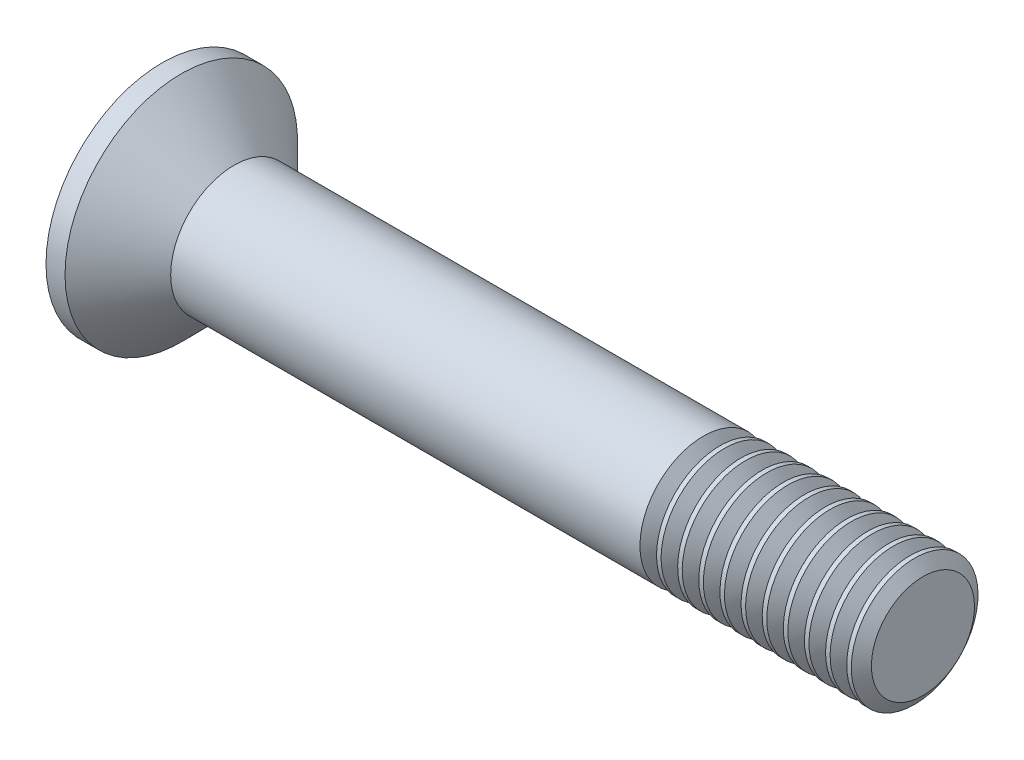
ISO-10303-21;
HEADER;
FILE_DESCRIPTION(('STEP AP214'),'2;1');
FILE_NAME('part.step','',(''),(''),'','','');
FILE_SCHEMA(('AUTOMOTIVE_DESIGN { 1 0 10303 214 1 1 1 1 }'));
ENDSEC;
DATA;
#1=APPLICATION_CONTEXT('core data for automotive mechanical design processes');
#2=APPLICATION_PROTOCOL_DEFINITION('international standard','automotive_design',2000,#1);
#3=PRODUCT_CONTEXT('',#1,'mechanical');
#4=PRODUCT('Part','Part','',(#3));
#5=PRODUCT_RELATED_PRODUCT_CATEGORY('part','',(#4));
#6=PRODUCT_DEFINITION_FORMATION('','',#4);
#7=PRODUCT_DEFINITION_CONTEXT('part definition',#1,'design');
#8=PRODUCT_DEFINITION('design','',#6,#7);
#9=PRODUCT_DEFINITION_SHAPE('','',#8);
#10=(LENGTH_UNIT() NAMED_UNIT(*) SI_UNIT(.MILLI.,.METRE.));
#11=(NAMED_UNIT(*) PLANE_ANGLE_UNIT() SI_UNIT($,.RADIAN.));
#12=(NAMED_UNIT(*) SI_UNIT($,.STERADIAN.) SOLID_ANGLE_UNIT());
#13=UNCERTAINTY_MEASURE_WITH_UNIT(LENGTH_MEASURE(1.E-05),#10,'distance_accuracy_value','');
#14=(GEOMETRIC_REPRESENTATION_CONTEXT(3) GLOBAL_UNCERTAINTY_ASSIGNED_CONTEXT((#13)) GLOBAL_UNIT_ASSIGNED_CONTEXT((#10,
#11,#12)) REPRESENTATION_CONTEXT('',''));
#15=CARTESIAN_POINT('',(0.,0.,0.));
#16=DIRECTION('',(0.,0.,1.));
#17=DIRECTION('',(1.,0.,0.));
#18=AXIS2_PLACEMENT_3D('',#15,#16,#17);
#19=CARTESIAN_POINT('',(0.,0.,0.));
#20=DIRECTION('',(-1.,0.,0.));
#21=DIRECTION('',(0.,0.,1.));
#22=AXIS2_PLACEMENT_3D('',#19,#20,#21);
#23=PLANE('',#22);
#24=CARTESIAN_POINT('',(0.,0.,0.));
#25=DIRECTION('',(-1.,0.,0.));
#26=DIRECTION('',(0.,0.,1.));
#27=AXIS2_PLACEMENT_3D('',#24,#25,#26);
#28=CIRCLE('',#27,2.75);
#29=CARTESIAN_POINT('',(0.,0.,2.75));
#30=VERTEX_POINT('',#29);
#31=EDGE_CURVE('E133',#30,#30,#28,.T.);
#32=ORIENTED_EDGE('',*,*,#31,.T.);
#33=EDGE_LOOP('',(#32));
#34=FACE_BOUND('',#33,.T.);
#35=DIRECTION('',(0.,1.,0.));
#36=VECTOR('',#35,1.);
#37=CARTESIAN_POINT('',(0.,-1.55,-0.395));
#38=LINE('',#37,#36);
#39=CARTESIAN_POINT('',(0.,-1.55,-0.395));
#40=VERTEX_POINT('',#39);
#41=CARTESIAN_POINT('',(0.,-0.394999999999999,-0.395));
#42=VERTEX_POINT('',#41);
#43=EDGE_CURVE('E108',#40,#42,#38,.T.);
#44=ORIENTED_EDGE('',*,*,#43,.T.);
#45=DIRECTION('',(0.,0.,-1.));
#46=VECTOR('',#45,1.);
#47=CARTESIAN_POINT('',(0.,-0.395000000000005,1.55));
#48=LINE('',#47,#46);
#49=CARTESIAN_POINT('',(0.,-0.394999999999995,-1.55));
#50=VERTEX_POINT('',#49);
#51=EDGE_CURVE('E88',#42,#50,#48,.T.);
#52=ORIENTED_EDGE('',*,*,#51,.T.);
#53=DIRECTION('',(0.,1.,0.));
#54=VECTOR('',#53,1.);
#55=CARTESIAN_POINT('',(0.,-0.394999999999995,-1.55));
#56=LINE('',#55,#54);
#57=CARTESIAN_POINT('',(0.,0.395000000000005,-1.55));
#58=VERTEX_POINT('',#57);
#59=EDGE_CURVE('E219',#50,#58,#56,.T.);
#60=ORIENTED_EDGE('',*,*,#59,.T.);
#61=DIRECTION('',(0.,0.,1.));
#62=VECTOR('',#61,1.);
#63=CARTESIAN_POINT('',(0.,0.395000000000005,-1.55));
#64=LINE('',#63,#62);
#65=CARTESIAN_POINT('',(0.,0.395000000000001,-0.395));
#66=VERTEX_POINT('',#65);
#67=EDGE_CURVE('E104',#58,#66,#64,.T.);
#68=ORIENTED_EDGE('',*,*,#67,.T.);
#69=CARTESIAN_POINT('',(0.,1.55,-0.395));
#70=VERTEX_POINT('',#69);
#71=EDGE_CURVE('E98',#66,#70,#38,.T.);
#72=ORIENTED_EDGE('',*,*,#71,.T.);
#73=DIRECTION('',(0.,0.,1.));
#74=VECTOR('',#73,1.);
#75=CARTESIAN_POINT('',(0.,1.55,-0.395));
#76=LINE('',#75,#74);
#77=CARTESIAN_POINT('',(0.,1.55,0.395));
#78=VERTEX_POINT('',#77);
#79=EDGE_CURVE('E101',#70,#78,#76,.T.);
#80=ORIENTED_EDGE('',*,*,#79,.T.);
#81=DIRECTION('',(0.,-1.,0.));
#82=VECTOR('',#81,1.);
#83=CARTESIAN_POINT('',(0.,1.55,0.395));
#84=LINE('',#83,#82);
#85=CARTESIAN_POINT('',(0.,0.394999999999998,0.395));
#86=VERTEX_POINT('',#85);
#87=EDGE_CURVE('E211',#78,#86,#84,.T.);
#88=ORIENTED_EDGE('',*,*,#87,.T.);
#89=CARTESIAN_POINT('',(0.,0.394999999999994,1.55));
#90=VERTEX_POINT('',#89);
#91=EDGE_CURVE('E229',#86,#90,#64,.T.);
#92=ORIENTED_EDGE('',*,*,#91,.T.);
#93=DIRECTION('',(0.,-1.,0.));
#94=VECTOR('',#93,1.);
#95=CARTESIAN_POINT('',(0.,0.394999999999994,1.55));
#96=LINE('',#95,#94);
#97=CARTESIAN_POINT('',(0.,-0.395000000000005,1.55));
#98=VERTEX_POINT('',#97);
#99=EDGE_CURVE('E231',#90,#98,#96,.T.);
#100=ORIENTED_EDGE('',*,*,#99,.T.);
#101=CARTESIAN_POINT('',(0.,-0.395000000000001,0.395));
#102=VERTEX_POINT('',#101);
#103=EDGE_CURVE('E233',#98,#102,#48,.T.);
#104=ORIENTED_EDGE('',*,*,#103,.T.);
#105=CARTESIAN_POINT('',(0.,-1.55,0.395));
#106=VERTEX_POINT('',#105);
#107=EDGE_CURVE('E114',#102,#106,#84,.T.);
#108=ORIENTED_EDGE('',*,*,#107,.T.);
#109=DIRECTION('',(0.,0.,-1.));
#110=VECTOR('',#109,1.);
#111=CARTESIAN_POINT('',(0.,-1.55,0.395));
#112=LINE('',#111,#110);
#113=EDGE_CURVE('E137',#106,#40,#112,.T.);
#114=ORIENTED_EDGE('',*,*,#113,.T.);
#115=EDGE_LOOP('',(#44,#52,#60,#68,#72,#80,#88,#92,#100,#104,#108,#114));
#116=FACE_BOUND('',#115,.T.);
#117=ADVANCED_FACE('F39',(#34,#116),#23,.T.);
#118=CARTESIAN_POINT('',(2.38373382624769,0.,0.16865988909427));
#119=DIRECTION('',(-0.0945267588569114,0.,-0.995522321125954));
#120=DIRECTION('',(-0.995522321125954,0.,0.0945267588569114));
#121=AXIS2_PLACEMENT_3D('',#118,#119,#120);
#122=PLANE('',#121);
#123=ORIENTED_EDGE('',*,*,#107,.F.);
#124=DIRECTION('',(0.991104257398676,0.0941072552097303,-0.09410725520973));
#125=VECTOR('',#124,1.);
#126=CARTESIAN_POINT('',(2.39946475118715,-0.16716620751949,0.167166207519489));
#127=LINE('',#126,#125);
#128=CARTESIAN_POINT('',(2.08,-0.197500000000001,0.197499999999999));
#129=VERTEX_POINT('',#128);
#130=EDGE_CURVE('E132',#102,#129,#127,.T.);
#131=ORIENTED_EDGE('',*,*,#130,.T.);
#132=DIRECTION('',(0.835707904588478,0.543411029305728,-0.0793520726712616));
#133=VECTOR('',#132,1.);
#134=CARTESIAN_POINT('',(0.,-1.55,0.395));
#135=LINE('',#134,#133);
#136=EDGE_CURVE('E109',#106,#129,#135,.T.);
#137=ORIENTED_EDGE('',*,*,#136,.F.);
#138=EDGE_LOOP('',(#123,#131,#137));
#139=FACE_BOUND('',#138,.T.);
#140=ADVANCED_FACE('F170',(#139),#122,.T.);
#141=DIRECTION('',(0.835707904588477,-0.543411029305729,-0.0793520726712615));
#142=VECTOR('',#141,1.);
#143=CARTESIAN_POINT('',(0.,1.55,0.395));
#144=LINE('',#143,#142);
#145=CARTESIAN_POINT('',(2.08,0.1975,0.1975));
#146=VERTEX_POINT('',#145);
#147=EDGE_CURVE('E54',#78,#146,#144,.T.);
#148=ORIENTED_EDGE('',*,*,#147,.T.);
#149=DIRECTION('',(-0.991104257398676,0.0941072552097295,0.0941072552097299));
#150=VECTOR('',#149,1.);
#151=CARTESIAN_POINT('',(2.39946475118715,0.167166207519489,0.167166207519489));
#152=LINE('',#151,#150);
#153=EDGE_CURVE('E215',#146,#86,#152,.T.);
#154=ORIENTED_EDGE('',*,*,#153,.T.);
#155=ORIENTED_EDGE('',*,*,#87,.F.);
#156=EDGE_LOOP('',(#148,#154,#155));
#157=FACE_BOUND('',#156,.T.);
#158=ADVANCED_FACE('F176',(#157),#122,.T.);
#159=CARTESIAN_POINT('',(2.38373382624769,0.,-0.16865988909427));
#160=DIRECTION('',(-0.0945267588569113,0.,0.995522321125954));
#161=DIRECTION('',(0.995522321125954,0.,0.0945267588569113));
#162=AXIS2_PLACEMENT_3D('',#159,#160,#161);
#163=PLANE('',#162);
#164=DIRECTION('',(0.835707904588478,0.543411029305728,0.0793520726712615));
#165=VECTOR('',#164,1.);
#166=CARTESIAN_POINT('',(0.,-1.55,-0.395));
#167=LINE('',#166,#165);
#168=CARTESIAN_POINT('',(2.08,-0.1975,-0.197500000000001));
#169=VERTEX_POINT('',#168);
#170=EDGE_CURVE('E63',#40,#169,#167,.T.);
#171=ORIENTED_EDGE('',*,*,#170,.T.);
#172=DIRECTION('',(-0.991104257398676,-0.0941072552097296,-0.0941072552097298));
#173=VECTOR('',#172,1.);
#174=CARTESIAN_POINT('',(2.39946475118715,-0.167166207519489,-0.167166207519489));
#175=LINE('',#174,#173);
#176=EDGE_CURVE('E11',#169,#42,#175,.T.);
#177=ORIENTED_EDGE('',*,*,#176,.T.);
#178=ORIENTED_EDGE('',*,*,#43,.F.);
#179=EDGE_LOOP('',(#171,#177,#178));
#180=FACE_BOUND('',#179,.T.);
#181=ADVANCED_FACE('F156',(#180),#163,.T.);
#182=ORIENTED_EDGE('',*,*,#71,.F.);
#183=DIRECTION('',(0.991104257398676,-0.0941072552097302,0.0941072552097298));
#184=VECTOR('',#183,1.);
#185=CARTESIAN_POINT('',(2.39946475118715,0.16716620751949,-0.167166207519489));
#186=LINE('',#185,#184);
#187=CARTESIAN_POINT('',(2.08,0.1975,-0.1975));
#188=VERTEX_POINT('',#187);
#189=EDGE_CURVE('E117',#66,#188,#186,.T.);
#190=ORIENTED_EDGE('',*,*,#189,.T.);
#191=DIRECTION('',(0.835707904588477,-0.543411029305729,0.0793520726712615));
#192=VECTOR('',#191,1.);
#193=CARTESIAN_POINT('',(0.,1.55,-0.395));
#194=LINE('',#193,#192);
#195=EDGE_CURVE('E113',#70,#188,#194,.T.);
#196=ORIENTED_EDGE('',*,*,#195,.F.);
#197=EDGE_LOOP('',(#182,#190,#196));
#198=FACE_BOUND('',#197,.T.);
#199=ADVANCED_FACE('F116',(#198),#163,.T.);
#200=CARTESIAN_POINT('',(-6.34999999999999,0.,0.));
#201=DIRECTION('',(-1.,0.,0.));
#202=DIRECTION('',(0.,0.,1.));
#203=AXIS2_PLACEMENT_3D('',#200,#201,#202);
#204=CYLINDRICAL_SURFACE('',#203,1.5);
#205=CARTESIAN_POINT('',(12.8035927855322,0.,0.));
#206=DIRECTION('',(-1.,0.,0.));
#207=DIRECTION('',(0.,-1.,0.));
#208=AXIS2_PLACEMENT_3D('',#205,#206,#207);
#209=CIRCLE('',#208,1.5);
#210=CARTESIAN_POINT('',(12.8035927855322,-1.5,0.));
#211=VERTEX_POINT('',#210);
#212=EDGE_CURVE('E240',#211,#211,#209,.T.);
#213=ORIENTED_EDGE('',*,*,#212,.T.);
#214=EDGE_LOOP('',(#213));
#215=FACE_BOUND('',#214,.T.);
#216=CARTESIAN_POINT('',(1.7,0.,0.));
#217=DIRECTION('',(-1.,0.,0.));
#218=DIRECTION('',(0.,0.,1.));
#219=AXIS2_PLACEMENT_3D('',#216,#217,#218);
#220=CIRCLE('',#219,1.5);
#221=CARTESIAN_POINT('',(1.7,0.,1.5));
#222=VERTEX_POINT('',#221);
#223=EDGE_CURVE('E47',#222,#222,#220,.T.);
#224=ORIENTED_EDGE('',*,*,#223,.F.);
#225=EDGE_LOOP('',(#224));
#226=FACE_BOUND('',#225,.T.);
#227=ADVANCED_FACE('F145',(#215,#226),#204,.T.);
#228=CARTESIAN_POINT('',(0.450000000000004,0.,0.));
#229=DIRECTION('',(-1.,0.,0.));
#230=DIRECTION('',(0.,0.,1.));
#231=AXIS2_PLACEMENT_3D('',#228,#229,#230);
#232=CONICAL_SURFACE('',#231,2.75,0.78539816339745);
#233=ORIENTED_EDGE('',*,*,#223,.T.);
#234=EDGE_LOOP('',(#233));
#235=FACE_BOUND('',#234,.T.);
#236=CARTESIAN_POINT('',(0.450000000000004,0.,0.));
#237=DIRECTION('',(-1.,0.,0.));
#238=DIRECTION('',(0.,0.,1.));
#239=AXIS2_PLACEMENT_3D('',#236,#237,#238);
#240=CIRCLE('',#239,2.75);
#241=CARTESIAN_POINT('',(0.450000000000004,0.,2.75));
#242=VERTEX_POINT('',#241);
#243=EDGE_CURVE('E136',#242,#242,#240,.T.);
#244=ORIENTED_EDGE('',*,*,#243,.F.);
#245=EDGE_LOOP('',(#244));
#246=FACE_BOUND('',#245,.T.);
#247=ADVANCED_FACE('F142',(#235,#246),#232,.T.);
#248=CARTESIAN_POINT('',(-6.34999999999999,0.,0.));
#249=DIRECTION('',(-1.,0.,0.));
#250=DIRECTION('',(0.,0.,1.));
#251=AXIS2_PLACEMENT_3D('',#248,#249,#250);
#252=CYLINDRICAL_SURFACE('',#251,2.75);
#253=ORIENTED_EDGE('',*,*,#243,.T.);
#254=EDGE_LOOP('',(#253));
#255=FACE_BOUND('',#254,.T.);
#256=ORIENTED_EDGE('',*,*,#31,.F.);
#257=EDGE_LOOP('',(#256));
#258=FACE_BOUND('',#257,.T.);
#259=ADVANCED_FACE('F154',(#255,#258),#252,.T.);
#260=CARTESIAN_POINT('',(2.08,0.1975,-0.1975));
#261=DIRECTION('',(1.,0.,0.));
#262=DIRECTION('',(0.,0.,-1.));
#263=AXIS2_PLACEMENT_3D('',#260,#261,#262);
#264=PLANE('',#263);
#265=DIRECTION('',(0.,1.,0.));
#266=VECTOR('',#265,1.);
#267=CARTESIAN_POINT('',(2.08,-0.1975,-0.1975));
#268=LINE('',#267,#266);
#269=EDGE_CURVE('E128',#169,#188,#268,.T.);
#270=ORIENTED_EDGE('',*,*,#269,.F.);
#271=DIRECTION('',(0.,0.,-1.));
#272=VECTOR('',#271,1.);
#273=CARTESIAN_POINT('',(2.08,-0.1975,0.1975));
#274=LINE('',#273,#272);
#275=EDGE_CURVE('E119',#129,#169,#274,.T.);
#276=ORIENTED_EDGE('',*,*,#275,.F.);
#277=DIRECTION('',(0.,-1.,0.));
#278=VECTOR('',#277,1.);
#279=CARTESIAN_POINT('',(2.08,0.1975,0.1975));
#280=LINE('',#279,#278);
#281=EDGE_CURVE('E122',#146,#129,#280,.T.);
#282=ORIENTED_EDGE('',*,*,#281,.F.);
#283=DIRECTION('',(0.,0.,1.));
#284=VECTOR('',#283,1.);
#285=CARTESIAN_POINT('',(2.08,0.1975,-0.1975));
#286=LINE('',#285,#284);
#287=EDGE_CURVE('E126',#188,#146,#286,.T.);
#288=ORIENTED_EDGE('',*,*,#287,.F.);
#289=EDGE_LOOP('',(#270,#276,#282,#288));
#290=FACE_BOUND('',#289,.T.);
#291=ADVANCED_FACE('F181',(#290),#264,.F.);
#292=CARTESIAN_POINT('',(2.08,-0.1975,-0.1975));
#293=DIRECTION('',(-0.54513001368185,0.838351518268576,0.));
#294=DIRECTION('',(-0.838351518268576,-0.54513001368185,0.));
#295=AXIS2_PLACEMENT_3D('',#292,#293,#294);
#296=PLANE('',#295);
#297=ORIENTED_EDGE('',*,*,#170,.F.);
#298=ORIENTED_EDGE('',*,*,#113,.F.);
#299=ORIENTED_EDGE('',*,*,#136,.T.);
#300=ORIENTED_EDGE('',*,*,#275,.T.);
#301=EDGE_LOOP('',(#297,#298,#299,#300));
#302=FACE_BOUND('',#301,.T.);
#303=ADVANCED_FACE('F188',(#302),#296,.T.);
#304=CARTESIAN_POINT('',(0.,1.55,0.395));
#305=DIRECTION('',(-0.54513001368185,-0.838351518268575,0.));
#306=DIRECTION('',(0.838351518268576,-0.54513001368185,0.));
#307=AXIS2_PLACEMENT_3D('',#304,#305,#306);
#308=PLANE('',#307);
#309=ORIENTED_EDGE('',*,*,#147,.F.);
#310=ORIENTED_EDGE('',*,*,#79,.F.);
#311=ORIENTED_EDGE('',*,*,#195,.T.);
#312=ORIENTED_EDGE('',*,*,#287,.T.);
#313=EDGE_LOOP('',(#309,#310,#311,#312));
#314=FACE_BOUND('',#313,.T.);
#315=ADVANCED_FACE('F112',(#314),#308,.T.);
#316=CARTESIAN_POINT('',(2.38373382624769,-0.16865988909427,0.));
#317=DIRECTION('',(-0.0945267588569114,0.995522321125954,0.));
#318=DIRECTION('',(-0.995522321125954,-0.0945267588569114,0.));
#319=AXIS2_PLACEMENT_3D('',#316,#317,#318);
#320=PLANE('',#319);
#321=DIRECTION('',(0.835707904588478,0.0793520726712597,0.543411029305728));
#322=VECTOR('',#321,1.);
#323=CARTESIAN_POINT('',(0.,-0.394999999999995,-1.55));
#324=LINE('',#323,#322);
#325=EDGE_CURVE('E227',#50,#169,#324,.T.);
#326=ORIENTED_EDGE('',*,*,#325,.F.);
#327=ORIENTED_EDGE('',*,*,#51,.F.);
#328=ORIENTED_EDGE('',*,*,#176,.F.);
#329=EDGE_LOOP('',(#326,#327,#328));
#330=FACE_BOUND('',#329,.T.);
#331=ADVANCED_FACE('F433',(#330),#320,.T.);
#332=CARTESIAN_POINT('',(2.38373382624769,0.16865988909427,0.));
#333=DIRECTION('',(-0.0945267588569113,-0.995522321125954,0.));
#334=DIRECTION('',(0.995522321125954,-0.0945267588569113,0.));
#335=AXIS2_PLACEMENT_3D('',#332,#333,#334);
#336=PLANE('',#335);
#337=ORIENTED_EDGE('',*,*,#67,.F.);
#338=DIRECTION('',(0.835707904588478,-0.0793520726712634,0.543411029305728));
#339=VECTOR('',#338,1.);
#340=CARTESIAN_POINT('',(0.,0.395000000000005,-1.55));
#341=LINE('',#340,#339);
#342=EDGE_CURVE('E79',#58,#188,#341,.T.);
#343=ORIENTED_EDGE('',*,*,#342,.T.);
#344=ORIENTED_EDGE('',*,*,#189,.F.);
#345=EDGE_LOOP('',(#337,#343,#344));
#346=FACE_BOUND('',#345,.T.);
#347=ADVANCED_FACE('F432',(#346),#336,.T.);
#348=CARTESIAN_POINT('',(2.08,0.197500000000001,-0.197499999999999));
#349=DIRECTION('',(-0.54513001368185,0.,0.838351518268576));
#350=DIRECTION('',(-0.838351518268576,0.,-0.54513001368185));
#351=AXIS2_PLACEMENT_3D('',#348,#349,#350);
#352=PLANE('',#351);
#353=ORIENTED_EDGE('',*,*,#342,.F.);
#354=ORIENTED_EDGE('',*,*,#59,.F.);
#355=ORIENTED_EDGE('',*,*,#325,.T.);
#356=ORIENTED_EDGE('',*,*,#269,.T.);
#357=EDGE_LOOP('',(#353,#354,#355,#356));
#358=FACE_BOUND('',#357,.T.);
#359=ADVANCED_FACE('F428',(#358),#352,.T.);
#360=ORIENTED_EDGE('',*,*,#103,.F.);
#361=DIRECTION('',(0.835707904588477,0.0793520726712634,-0.543411029305728));
#362=VECTOR('',#361,1.);
#363=CARTESIAN_POINT('',(0.,-0.395000000000005,1.55));
#364=LINE('',#363,#362);
#365=EDGE_CURVE('E222',#98,#129,#364,.T.);
#366=ORIENTED_EDGE('',*,*,#365,.T.);
#367=ORIENTED_EDGE('',*,*,#130,.F.);
#368=EDGE_LOOP('',(#360,#366,#367));
#369=FACE_BOUND('',#368,.T.);
#370=ADVANCED_FACE('F431',(#369),#320,.T.);
#371=DIRECTION('',(0.835707904588477,-0.0793520726712596,-0.543411029305729));
#372=VECTOR('',#371,1.);
#373=CARTESIAN_POINT('',(0.,0.394999999999994,1.55));
#374=LINE('',#373,#372);
#375=EDGE_CURVE('E220',#90,#146,#374,.T.);
#376=ORIENTED_EDGE('',*,*,#375,.F.);
#377=ORIENTED_EDGE('',*,*,#91,.F.);
#378=ORIENTED_EDGE('',*,*,#153,.F.);
#379=EDGE_LOOP('',(#376,#377,#378));
#380=FACE_BOUND('',#379,.T.);
#381=ADVANCED_FACE('F438',(#380),#336,.T.);
#382=CARTESIAN_POINT('',(0.,-0.395000000000005,1.55));
#383=DIRECTION('',(-0.54513001368185,0.,-0.838351518268575));
#384=DIRECTION('',(0.838351518268576,0.,-0.54513001368185));
#385=AXIS2_PLACEMENT_3D('',#382,#383,#384);
#386=PLANE('',#385);
#387=ORIENTED_EDGE('',*,*,#365,.F.);
#388=ORIENTED_EDGE('',*,*,#99,.F.);
#389=ORIENTED_EDGE('',*,*,#375,.T.);
#390=ORIENTED_EDGE('',*,*,#281,.T.);
#391=EDGE_LOOP('',(#387,#388,#389,#390));
#392=FACE_BOUND('',#391,.T.);
#393=ADVANCED_FACE('F426',(#392),#386,.T.);
#394=CARTESIAN_POINT('',(13.1964092144678,0.,0.));
#395=DIRECTION('',(1.,0.,0.));
#396=DIRECTION('',(0.,1.,0.));
#397=AXIS2_PLACEMENT_3D('',#394,#395,#396);
#398=CONICAL_SURFACE('',#397,1.5,0.959931088596888);
#399=CARTESIAN_POINT('',(13.000001,0.,0.));
#400=DIRECTION('',(-1.,0.,0.));
#401=DIRECTION('',(0.,-1.,0.));
#402=AXIS2_PLACEMENT_3D('',#399,#400,#401);
#403=CIRCLE('',#402,1.2195);
#404=CARTESIAN_POINT('',(13.000001,-1.2195,0.));
#405=VERTEX_POINT('',#404);
#406=EDGE_CURVE('E242',#405,#405,#403,.T.);
#407=ORIENTED_EDGE('',*,*,#406,.F.);
#408=EDGE_LOOP('',(#407));
#409=FACE_BOUND('',#408,.T.);
#410=CARTESIAN_POINT('',(13.1964092144678,0.,0.));
#411=DIRECTION('',(-1.,0.,0.));
#412=DIRECTION('',(0.,-1.,0.));
#413=AXIS2_PLACEMENT_3D('',#410,#411,#412);
#414=CIRCLE('',#413,1.5);
#415=CARTESIAN_POINT('',(13.1964092144678,-1.5,0.));
#416=VERTEX_POINT('',#415);
#417=EDGE_CURVE('E223',#416,#416,#414,.T.);
#418=ORIENTED_EDGE('',*,*,#417,.T.);
#419=EDGE_LOOP('',(#418));
#420=FACE_BOUND('',#419,.T.);
#421=ADVANCED_FACE('F422',(#409,#420),#398,.T.);
#422=CARTESIAN_POINT('',(13.000001,0.,0.));
#423=DIRECTION('',(-1.,0.,0.));
#424=DIRECTION('',(0.,-1.,0.));
#425=AXIS2_PLACEMENT_3D('',#422,#423,#424);
#426=CONICAL_SURFACE('',#425,1.2195,0.95993108859688);
#427=ORIENTED_EDGE('',*,*,#212,.F.);
#428=EDGE_LOOP('',(#427));
#429=FACE_BOUND('',#428,.T.);
#430=ORIENTED_EDGE('',*,*,#406,.T.);
#431=EDGE_LOOP('',(#430));
#432=FACE_BOUND('',#431,.T.);
#433=ADVANCED_FACE('F166',(#429,#432),#426,.T.);
#434=CARTESIAN_POINT('',(13.3035927855322,0.,0.));
#435=DIRECTION('',(-1.,0.,0.));
#436=DIRECTION('',(0.,-1.,0.));
#437=AXIS2_PLACEMENT_3D('',#434,#435,#436);
#438=CIRCLE('',#437,1.5);
#439=CARTESIAN_POINT('',(13.3035927855322,-1.5,0.));
#440=VERTEX_POINT('',#439);
#441=EDGE_CURVE('E248',#440,#440,#438,.T.);
#442=ORIENTED_EDGE('',*,*,#441,.T.);
#443=EDGE_LOOP('',(#442));
#444=FACE_BOUND('',#443,.T.);
#445=ORIENTED_EDGE('',*,*,#417,.F.);
#446=EDGE_LOOP('',(#445));
#447=FACE_BOUND('',#446,.T.);
#448=ADVANCED_FACE('F149',(#444,#447),#204,.T.);
#449=CARTESIAN_POINT('',(13.6964092144678,0.,0.));
#450=DIRECTION('',(1.,0.,0.));
#451=DIRECTION('',(0.,1.,0.));
#452=AXIS2_PLACEMENT_3D('',#449,#450,#451);
#453=CONICAL_SURFACE('',#452,1.5,0.959931088596888);
#454=CARTESIAN_POINT('',(13.500001,0.,0.));
#455=DIRECTION('',(-1.,0.,0.));
#456=DIRECTION('',(0.,-1.,0.));
#457=AXIS2_PLACEMENT_3D('',#454,#455,#456);
#458=CIRCLE('',#457,1.2195);
#459=CARTESIAN_POINT('',(13.500001,-1.2195,0.));
#460=VERTEX_POINT('',#459);
#461=EDGE_CURVE('E251',#460,#460,#458,.T.);
#462=ORIENTED_EDGE('',*,*,#461,.F.);
#463=EDGE_LOOP('',(#462));
#464=FACE_BOUND('',#463,.T.);
#465=CARTESIAN_POINT('',(13.6964092144678,0.,0.));
#466=DIRECTION('',(-1.,0.,0.));
#467=DIRECTION('',(0.,-1.,0.));
#468=AXIS2_PLACEMENT_3D('',#465,#466,#467);
#469=CIRCLE('',#468,1.5);
#470=CARTESIAN_POINT('',(13.6964092144678,-1.5,0.));
#471=VERTEX_POINT('',#470);
#472=EDGE_CURVE('E245',#471,#471,#469,.T.);
#473=ORIENTED_EDGE('',*,*,#472,.T.);
#474=EDGE_LOOP('',(#473));
#475=FACE_BOUND('',#474,.T.);
#476=ADVANCED_FACE('F165',(#464,#475),#453,.T.);
#477=CARTESIAN_POINT('',(13.500001,0.,0.));
#478=DIRECTION('',(-1.,0.,0.));
#479=DIRECTION('',(0.,-1.,0.));
#480=AXIS2_PLACEMENT_3D('',#477,#478,#479);
#481=CONICAL_SURFACE('',#480,1.2195,0.95993108859688);
#482=ORIENTED_EDGE('',*,*,#441,.F.);
#483=EDGE_LOOP('',(#482));
#484=FACE_BOUND('',#483,.T.);
#485=ORIENTED_EDGE('',*,*,#461,.T.);
#486=EDGE_LOOP('',(#485));
#487=FACE_BOUND('',#486,.T.);
#488=ADVANCED_FACE('F413',(#484,#487),#481,.T.);
#489=CARTESIAN_POINT('',(13.8035927855322,0.,0.));
#490=DIRECTION('',(-1.,0.,0.));
#491=DIRECTION('',(0.,-1.,0.));
#492=AXIS2_PLACEMENT_3D('',#489,#490,#491);
#493=CIRCLE('',#492,1.5);
#494=CARTESIAN_POINT('',(13.8035927855322,-1.5,0.));
#495=VERTEX_POINT('',#494);
#496=EDGE_CURVE('E257',#495,#495,#493,.T.);
#497=ORIENTED_EDGE('',*,*,#496,.T.);
#498=EDGE_LOOP('',(#497));
#499=FACE_BOUND('',#498,.T.);
#500=ORIENTED_EDGE('',*,*,#472,.F.);
#501=EDGE_LOOP('',(#500));
#502=FACE_BOUND('',#501,.T.);
#503=ADVANCED_FACE('F168',(#499,#502),#204,.T.);
#504=CARTESIAN_POINT('',(14.1964092144678,0.,0.));
#505=DIRECTION('',(1.,0.,0.));
#506=DIRECTION('',(0.,1.,0.));
#507=AXIS2_PLACEMENT_3D('',#504,#505,#506);
#508=CONICAL_SURFACE('',#507,1.5,0.959931088596888);
#509=CARTESIAN_POINT('',(14.000001,0.,0.));
#510=DIRECTION('',(-1.,0.,0.));
#511=DIRECTION('',(0.,-1.,0.));
#512=AXIS2_PLACEMENT_3D('',#509,#510,#511);
#513=CIRCLE('',#512,1.2195);
#514=CARTESIAN_POINT('',(14.000001,-1.2195,0.));
#515=VERTEX_POINT('',#514);
#516=EDGE_CURVE('E260',#515,#515,#513,.T.);
#517=ORIENTED_EDGE('',*,*,#516,.F.);
#518=EDGE_LOOP('',(#517));
#519=FACE_BOUND('',#518,.T.);
#520=CARTESIAN_POINT('',(14.1964092144678,0.,0.));
#521=DIRECTION('',(-1.,0.,0.));
#522=DIRECTION('',(0.,-1.,0.));
#523=AXIS2_PLACEMENT_3D('',#520,#521,#522);
#524=CIRCLE('',#523,1.5);
#525=CARTESIAN_POINT('',(14.1964092144678,-1.5,0.));
#526=VERTEX_POINT('',#525);
#527=EDGE_CURVE('E254',#526,#526,#524,.T.);
#528=ORIENTED_EDGE('',*,*,#527,.T.);
#529=EDGE_LOOP('',(#528));
#530=FACE_BOUND('',#529,.T.);
#531=ADVANCED_FACE('F408',(#519,#530),#508,.T.);
#532=CARTESIAN_POINT('',(14.000001,0.,0.));
#533=DIRECTION('',(-1.,0.,0.));
#534=DIRECTION('',(0.,-1.,0.));
#535=AXIS2_PLACEMENT_3D('',#532,#533,#534);
#536=CONICAL_SURFACE('',#535,1.2195,0.95993108859688);
#537=ORIENTED_EDGE('',*,*,#496,.F.);
#538=EDGE_LOOP('',(#537));
#539=FACE_BOUND('',#538,.T.);
#540=ORIENTED_EDGE('',*,*,#516,.T.);
#541=EDGE_LOOP('',(#540));
#542=FACE_BOUND('',#541,.T.);
#543=ADVANCED_FACE('F405',(#539,#542),#536,.T.);
#544=CARTESIAN_POINT('',(14.3035927855322,0.,0.));
#545=DIRECTION('',(-1.,0.,0.));
#546=DIRECTION('',(0.,-1.,0.));
#547=AXIS2_PLACEMENT_3D('',#544,#545,#546);
#548=CIRCLE('',#547,1.5);
#549=CARTESIAN_POINT('',(14.3035927855322,-1.5,0.));
#550=VERTEX_POINT('',#549);
#551=EDGE_CURVE('E266',#550,#550,#548,.T.);
#552=ORIENTED_EDGE('',*,*,#551,.T.);
#553=EDGE_LOOP('',(#552));
#554=FACE_BOUND('',#553,.T.);
#555=ORIENTED_EDGE('',*,*,#527,.F.);
#556=EDGE_LOOP('',(#555));
#557=FACE_BOUND('',#556,.T.);
#558=ADVANCED_FACE('F403',(#554,#557),#204,.T.);
#559=CARTESIAN_POINT('',(14.6964092144678,0.,0.));
#560=DIRECTION('',(1.,0.,0.));
#561=DIRECTION('',(0.,1.,0.));
#562=AXIS2_PLACEMENT_3D('',#559,#560,#561);
#563=CONICAL_SURFACE('',#562,1.5,0.959931088596888);
#564=CARTESIAN_POINT('',(14.500001,0.,0.));
#565=DIRECTION('',(-1.,0.,0.));
#566=DIRECTION('',(0.,-1.,0.));
#567=AXIS2_PLACEMENT_3D('',#564,#565,#566);
#568=CIRCLE('',#567,1.2195);
#569=CARTESIAN_POINT('',(14.500001,-1.2195,0.));
#570=VERTEX_POINT('',#569);
#571=EDGE_CURVE('E269',#570,#570,#568,.T.);
#572=ORIENTED_EDGE('',*,*,#571,.F.);
#573=EDGE_LOOP('',(#572));
#574=FACE_BOUND('',#573,.T.);
#575=CARTESIAN_POINT('',(14.6964092144678,0.,0.));
#576=DIRECTION('',(-1.,0.,0.));
#577=DIRECTION('',(0.,-1.,0.));
#578=AXIS2_PLACEMENT_3D('',#575,#576,#577);
#579=CIRCLE('',#578,1.5);
#580=CARTESIAN_POINT('',(14.6964092144678,-1.5,0.));
#581=VERTEX_POINT('',#580);
#582=EDGE_CURVE('E263',#581,#581,#579,.T.);
#583=ORIENTED_EDGE('',*,*,#582,.T.);
#584=EDGE_LOOP('',(#583));
#585=FACE_BOUND('',#584,.T.);
#586=ADVANCED_FACE('F399',(#574,#585),#563,.T.);
#587=CARTESIAN_POINT('',(14.500001,0.,0.));
#588=DIRECTION('',(-1.,0.,0.));
#589=DIRECTION('',(0.,-1.,0.));
#590=AXIS2_PLACEMENT_3D('',#587,#588,#589);
#591=CONICAL_SURFACE('',#590,1.2195,0.95993108859688);
#592=ORIENTED_EDGE('',*,*,#551,.F.);
#593=EDGE_LOOP('',(#592));
#594=FACE_BOUND('',#593,.T.);
#595=ORIENTED_EDGE('',*,*,#571,.T.);
#596=EDGE_LOOP('',(#595));
#597=FACE_BOUND('',#596,.T.);
#598=ADVANCED_FACE('F396',(#594,#597),#591,.T.);
#599=CARTESIAN_POINT('',(14.8035927855322,0.,0.));
#600=DIRECTION('',(-1.,0.,0.));
#601=DIRECTION('',(0.,-1.,0.));
#602=AXIS2_PLACEMENT_3D('',#599,#600,#601);
#603=CIRCLE('',#602,1.5);
#604=CARTESIAN_POINT('',(14.8035927855322,-1.5,0.));
#605=VERTEX_POINT('',#604);
#606=EDGE_CURVE('E275',#605,#605,#603,.T.);
#607=ORIENTED_EDGE('',*,*,#606,.T.);
#608=EDGE_LOOP('',(#607));
#609=FACE_BOUND('',#608,.T.);
#610=ORIENTED_EDGE('',*,*,#582,.F.);
#611=EDGE_LOOP('',(#610));
#612=FACE_BOUND('',#611,.T.);
#613=ADVANCED_FACE('F394',(#609,#612),#204,.T.);
#614=CARTESIAN_POINT('',(15.1964092144678,0.,0.));
#615=DIRECTION('',(1.,0.,0.));
#616=DIRECTION('',(0.,1.,0.));
#617=AXIS2_PLACEMENT_3D('',#614,#615,#616);
#618=CONICAL_SURFACE('',#617,1.5,0.959931088596888);
#619=CARTESIAN_POINT('',(15.000001,0.,0.));
#620=DIRECTION('',(-1.,0.,0.));
#621=DIRECTION('',(0.,-1.,0.));
#622=AXIS2_PLACEMENT_3D('',#619,#620,#621);
#623=CIRCLE('',#622,1.2195);
#624=CARTESIAN_POINT('',(15.000001,-1.2195,0.));
#625=VERTEX_POINT('',#624);
#626=EDGE_CURVE('E278',#625,#625,#623,.T.);
#627=ORIENTED_EDGE('',*,*,#626,.F.);
#628=EDGE_LOOP('',(#627));
#629=FACE_BOUND('',#628,.T.);
#630=CARTESIAN_POINT('',(15.1964092144678,0.,0.));
#631=DIRECTION('',(-1.,0.,0.));
#632=DIRECTION('',(0.,-1.,0.));
#633=AXIS2_PLACEMENT_3D('',#630,#631,#632);
#634=CIRCLE('',#633,1.5);
#635=CARTESIAN_POINT('',(15.1964092144678,-1.5,0.));
#636=VERTEX_POINT('',#635);
#637=EDGE_CURVE('E272',#636,#636,#634,.T.);
#638=ORIENTED_EDGE('',*,*,#637,.T.);
#639=EDGE_LOOP('',(#638));
#640=FACE_BOUND('',#639,.T.);
#641=ADVANCED_FACE('F390',(#629,#640),#618,.T.);
#642=CARTESIAN_POINT('',(15.000001,0.,0.));
#643=DIRECTION('',(-1.,0.,0.));
#644=DIRECTION('',(0.,-1.,0.));
#645=AXIS2_PLACEMENT_3D('',#642,#643,#644);
#646=CONICAL_SURFACE('',#645,1.2195,0.95993108859688);
#647=ORIENTED_EDGE('',*,*,#606,.F.);
#648=EDGE_LOOP('',(#647));
#649=FACE_BOUND('',#648,.T.);
#650=ORIENTED_EDGE('',*,*,#626,.T.);
#651=EDGE_LOOP('',(#650));
#652=FACE_BOUND('',#651,.T.);
#653=ADVANCED_FACE('F387',(#649,#652),#646,.T.);
#654=CARTESIAN_POINT('',(15.3035927855322,0.,0.));
#655=DIRECTION('',(-1.,0.,0.));
#656=DIRECTION('',(0.,-1.,0.));
#657=AXIS2_PLACEMENT_3D('',#654,#655,#656);
#658=CIRCLE('',#657,1.5);
#659=CARTESIAN_POINT('',(15.3035927855322,-1.5,0.));
#660=VERTEX_POINT('',#659);
#661=EDGE_CURVE('E284',#660,#660,#658,.T.);
#662=ORIENTED_EDGE('',*,*,#661,.T.);
#663=EDGE_LOOP('',(#662));
#664=FACE_BOUND('',#663,.T.);
#665=ORIENTED_EDGE('',*,*,#637,.F.);
#666=EDGE_LOOP('',(#665));
#667=FACE_BOUND('',#666,.T.);
#668=ADVANCED_FACE('F385',(#664,#667),#204,.T.);
#669=CARTESIAN_POINT('',(15.6964092144678,0.,0.));
#670=DIRECTION('',(1.,0.,0.));
#671=DIRECTION('',(0.,1.,0.));
#672=AXIS2_PLACEMENT_3D('',#669,#670,#671);
#673=CONICAL_SURFACE('',#672,1.5,0.959931088596888);
#674=CARTESIAN_POINT('',(15.500001,0.,0.));
#675=DIRECTION('',(-1.,0.,0.));
#676=DIRECTION('',(0.,-1.,0.));
#677=AXIS2_PLACEMENT_3D('',#674,#675,#676);
#678=CIRCLE('',#677,1.2195);
#679=CARTESIAN_POINT('',(15.500001,-1.2195,0.));
#680=VERTEX_POINT('',#679);
#681=EDGE_CURVE('E287',#680,#680,#678,.T.);
#682=ORIENTED_EDGE('',*,*,#681,.F.);
#683=EDGE_LOOP('',(#682));
#684=FACE_BOUND('',#683,.T.);
#685=CARTESIAN_POINT('',(15.6964092144678,0.,0.));
#686=DIRECTION('',(-1.,0.,0.));
#687=DIRECTION('',(0.,-1.,0.));
#688=AXIS2_PLACEMENT_3D('',#685,#686,#687);
#689=CIRCLE('',#688,1.5);
#690=CARTESIAN_POINT('',(15.6964092144678,-1.5,0.));
#691=VERTEX_POINT('',#690);
#692=EDGE_CURVE('E281',#691,#691,#689,.T.);
#693=ORIENTED_EDGE('',*,*,#692,.T.);
#694=EDGE_LOOP('',(#693));
#695=FACE_BOUND('',#694,.T.);
#696=ADVANCED_FACE('F381',(#684,#695),#673,.T.);
#697=CARTESIAN_POINT('',(15.500001,0.,0.));
#698=DIRECTION('',(-1.,0.,0.));
#699=DIRECTION('',(0.,-1.,0.));
#700=AXIS2_PLACEMENT_3D('',#697,#698,#699);
#701=CONICAL_SURFACE('',#700,1.2195,0.95993108859688);
#702=ORIENTED_EDGE('',*,*,#661,.F.);
#703=EDGE_LOOP('',(#702));
#704=FACE_BOUND('',#703,.T.);
#705=ORIENTED_EDGE('',*,*,#681,.T.);
#706=EDGE_LOOP('',(#705));
#707=FACE_BOUND('',#706,.T.);
#708=ADVANCED_FACE('F378',(#704,#707),#701,.T.);
#709=CARTESIAN_POINT('',(15.8035927855322,0.,0.));
#710=DIRECTION('',(-1.,0.,0.));
#711=DIRECTION('',(0.,-1.,0.));
#712=AXIS2_PLACEMENT_3D('',#709,#710,#711);
#713=CIRCLE('',#712,1.5);
#714=CARTESIAN_POINT('',(15.8035927855322,-1.5,0.));
#715=VERTEX_POINT('',#714);
#716=EDGE_CURVE('E293',#715,#715,#713,.T.);
#717=ORIENTED_EDGE('',*,*,#716,.T.);
#718=EDGE_LOOP('',(#717));
#719=FACE_BOUND('',#718,.T.);
#720=ORIENTED_EDGE('',*,*,#692,.F.);
#721=EDGE_LOOP('',(#720));
#722=FACE_BOUND('',#721,.T.);
#723=ADVANCED_FACE('F376',(#719,#722),#204,.T.);
#724=CARTESIAN_POINT('',(16.1964092144678,0.,0.));
#725=DIRECTION('',(1.,0.,0.));
#726=DIRECTION('',(0.,1.,0.));
#727=AXIS2_PLACEMENT_3D('',#724,#725,#726);
#728=CONICAL_SURFACE('',#727,1.5,0.959931088596888);
#729=CARTESIAN_POINT('',(16.000001,0.,0.));
#730=DIRECTION('',(-1.,0.,0.));
#731=DIRECTION('',(0.,-1.,0.));
#732=AXIS2_PLACEMENT_3D('',#729,#730,#731);
#733=CIRCLE('',#732,1.2195);
#734=CARTESIAN_POINT('',(16.000001,-1.2195,0.));
#735=VERTEX_POINT('',#734);
#736=EDGE_CURVE('E296',#735,#735,#733,.T.);
#737=ORIENTED_EDGE('',*,*,#736,.F.);
#738=EDGE_LOOP('',(#737));
#739=FACE_BOUND('',#738,.T.);
#740=CARTESIAN_POINT('',(16.1964092144678,0.,0.));
#741=DIRECTION('',(-1.,0.,0.));
#742=DIRECTION('',(0.,-1.,0.));
#743=AXIS2_PLACEMENT_3D('',#740,#741,#742);
#744=CIRCLE('',#743,1.5);
#745=CARTESIAN_POINT('',(16.1964092144678,-1.5,0.));
#746=VERTEX_POINT('',#745);
#747=EDGE_CURVE('E290',#746,#746,#744,.T.);
#748=ORIENTED_EDGE('',*,*,#747,.T.);
#749=EDGE_LOOP('',(#748));
#750=FACE_BOUND('',#749,.T.);
#751=ADVANCED_FACE('F372',(#739,#750),#728,.T.);
#752=CARTESIAN_POINT('',(16.000001,0.,0.));
#753=DIRECTION('',(-1.,0.,0.));
#754=DIRECTION('',(0.,-1.,0.));
#755=AXIS2_PLACEMENT_3D('',#752,#753,#754);
#756=CONICAL_SURFACE('',#755,1.2195,0.95993108859688);
#757=ORIENTED_EDGE('',*,*,#716,.F.);
#758=EDGE_LOOP('',(#757));
#759=FACE_BOUND('',#758,.T.);
#760=ORIENTED_EDGE('',*,*,#736,.T.);
#761=EDGE_LOOP('',(#760));
#762=FACE_BOUND('',#761,.T.);
#763=ADVANCED_FACE('F369',(#759,#762),#756,.T.);
#764=CARTESIAN_POINT('',(16.3035927855322,0.,0.));
#765=DIRECTION('',(-1.,0.,0.));
#766=DIRECTION('',(0.,-1.,0.));
#767=AXIS2_PLACEMENT_3D('',#764,#765,#766);
#768=CIRCLE('',#767,1.5);
#769=CARTESIAN_POINT('',(16.3035927855322,-1.5,0.));
#770=VERTEX_POINT('',#769);
#771=EDGE_CURVE('E302',#770,#770,#768,.T.);
#772=ORIENTED_EDGE('',*,*,#771,.T.);
#773=EDGE_LOOP('',(#772));
#774=FACE_BOUND('',#773,.T.);
#775=ORIENTED_EDGE('',*,*,#747,.F.);
#776=EDGE_LOOP('',(#775));
#777=FACE_BOUND('',#776,.T.);
#778=ADVANCED_FACE('F367',(#774,#777),#204,.T.);
#779=CARTESIAN_POINT('',(16.6964092144678,0.,0.));
#780=DIRECTION('',(1.,0.,0.));
#781=DIRECTION('',(0.,1.,0.));
#782=AXIS2_PLACEMENT_3D('',#779,#780,#781);
#783=CONICAL_SURFACE('',#782,1.5,0.959931088596888);
#784=CARTESIAN_POINT('',(16.500001,0.,0.));
#785=DIRECTION('',(-1.,0.,0.));
#786=DIRECTION('',(0.,-1.,0.));
#787=AXIS2_PLACEMENT_3D('',#784,#785,#786);
#788=CIRCLE('',#787,1.2195);
#789=CARTESIAN_POINT('',(16.500001,-1.2195,0.));
#790=VERTEX_POINT('',#789);
#791=EDGE_CURVE('E305',#790,#790,#788,.T.);
#792=ORIENTED_EDGE('',*,*,#791,.F.);
#793=EDGE_LOOP('',(#792));
#794=FACE_BOUND('',#793,.T.);
#795=CARTESIAN_POINT('',(16.6964092144678,0.,0.));
#796=DIRECTION('',(-1.,0.,0.));
#797=DIRECTION('',(0.,-1.,0.));
#798=AXIS2_PLACEMENT_3D('',#795,#796,#797);
#799=CIRCLE('',#798,1.5);
#800=CARTESIAN_POINT('',(16.6964092144678,-1.5,0.));
#801=VERTEX_POINT('',#800);
#802=EDGE_CURVE('E299',#801,#801,#799,.T.);
#803=ORIENTED_EDGE('',*,*,#802,.T.);
#804=EDGE_LOOP('',(#803));
#805=FACE_BOUND('',#804,.T.);
#806=ADVANCED_FACE('F363',(#794,#805),#783,.T.);
#807=CARTESIAN_POINT('',(16.500001,0.,0.));
#808=DIRECTION('',(-1.,0.,0.));
#809=DIRECTION('',(0.,-1.,0.));
#810=AXIS2_PLACEMENT_3D('',#807,#808,#809);
#811=CONICAL_SURFACE('',#810,1.2195,0.95993108859688);
#812=ORIENTED_EDGE('',*,*,#771,.F.);
#813=EDGE_LOOP('',(#812));
#814=FACE_BOUND('',#813,.T.);
#815=ORIENTED_EDGE('',*,*,#791,.T.);
#816=EDGE_LOOP('',(#815));
#817=FACE_BOUND('',#816,.T.);
#818=ADVANCED_FACE('F360',(#814,#817),#811,.T.);
#819=CARTESIAN_POINT('',(16.8035927855322,0.,0.));
#820=DIRECTION('',(-1.,0.,0.));
#821=DIRECTION('',(0.,-1.,0.));
#822=AXIS2_PLACEMENT_3D('',#819,#820,#821);
#823=CIRCLE('',#822,1.5);
#824=CARTESIAN_POINT('',(16.8035927855322,-1.5,0.));
#825=VERTEX_POINT('',#824);
#826=EDGE_CURVE('E311',#825,#825,#823,.T.);
#827=ORIENTED_EDGE('',*,*,#826,.T.);
#828=EDGE_LOOP('',(#827));
#829=FACE_BOUND('',#828,.T.);
#830=ORIENTED_EDGE('',*,*,#802,.F.);
#831=EDGE_LOOP('',(#830));
#832=FACE_BOUND('',#831,.T.);
#833=ADVANCED_FACE('F358',(#829,#832),#204,.T.);
#834=CARTESIAN_POINT('',(17.1964092144678,0.,0.));
#835=DIRECTION('',(1.,0.,0.));
#836=DIRECTION('',(0.,1.,0.));
#837=AXIS2_PLACEMENT_3D('',#834,#835,#836);
#838=CONICAL_SURFACE('',#837,1.5,0.959931088596888);
#839=CARTESIAN_POINT('',(17.000001,0.,0.));
#840=DIRECTION('',(-1.,0.,0.));
#841=DIRECTION('',(0.,-1.,0.));
#842=AXIS2_PLACEMENT_3D('',#839,#840,#841);
#843=CIRCLE('',#842,1.2195);
#844=CARTESIAN_POINT('',(17.000001,-1.2195,0.));
#845=VERTEX_POINT('',#844);
#846=EDGE_CURVE('E314',#845,#845,#843,.T.);
#847=ORIENTED_EDGE('',*,*,#846,.F.);
#848=EDGE_LOOP('',(#847));
#849=FACE_BOUND('',#848,.T.);
#850=CARTESIAN_POINT('',(17.1964092144678,0.,0.));
#851=DIRECTION('',(-1.,0.,0.));
#852=DIRECTION('',(0.,-1.,0.));
#853=AXIS2_PLACEMENT_3D('',#850,#851,#852);
#854=CIRCLE('',#853,1.5);
#855=CARTESIAN_POINT('',(17.1964092144678,-1.5,0.));
#856=VERTEX_POINT('',#855);
#857=EDGE_CURVE('E308',#856,#856,#854,.T.);
#858=ORIENTED_EDGE('',*,*,#857,.T.);
#859=EDGE_LOOP('',(#858));
#860=FACE_BOUND('',#859,.T.);
#861=ADVANCED_FACE('F354',(#849,#860),#838,.T.);
#862=CARTESIAN_POINT('',(17.000001,0.,0.));
#863=DIRECTION('',(-1.,0.,0.));
#864=DIRECTION('',(0.,-1.,0.));
#865=AXIS2_PLACEMENT_3D('',#862,#863,#864);
#866=CONICAL_SURFACE('',#865,1.2195,0.95993108859688);
#867=ORIENTED_EDGE('',*,*,#826,.F.);
#868=EDGE_LOOP('',(#867));
#869=FACE_BOUND('',#868,.T.);
#870=ORIENTED_EDGE('',*,*,#846,.T.);
#871=EDGE_LOOP('',(#870));
#872=FACE_BOUND('',#871,.T.);
#873=ADVANCED_FACE('F351',(#869,#872),#866,.T.);
#874=CARTESIAN_POINT('',(17.3035927855322,0.,0.));
#875=DIRECTION('',(-1.,0.,0.));
#876=DIRECTION('',(0.,-1.,0.));
#877=AXIS2_PLACEMENT_3D('',#874,#875,#876);
#878=CIRCLE('',#877,1.5);
#879=CARTESIAN_POINT('',(17.3035927855322,-1.5,0.));
#880=VERTEX_POINT('',#879);
#881=EDGE_CURVE('E320',#880,#880,#878,.T.);
#882=ORIENTED_EDGE('',*,*,#881,.T.);
#883=EDGE_LOOP('',(#882));
#884=FACE_BOUND('',#883,.T.);
#885=ORIENTED_EDGE('',*,*,#857,.F.);
#886=EDGE_LOOP('',(#885));
#887=FACE_BOUND('',#886,.T.);
#888=ADVANCED_FACE('F163',(#884,#887),#204,.T.);
#889=CARTESIAN_POINT('',(17.6964092144678,0.,0.));
#890=DIRECTION('',(1.,0.,0.));
#891=DIRECTION('',(0.,1.,0.));
#892=AXIS2_PLACEMENT_3D('',#889,#890,#891);
#893=CONICAL_SURFACE('',#892,1.5,0.959931088596888);
#894=CARTESIAN_POINT('',(17.500001,0.,0.));
#895=DIRECTION('',(-1.,0.,0.));
#896=DIRECTION('',(0.,-1.,0.));
#897=AXIS2_PLACEMENT_3D('',#894,#895,#896);
#898=CIRCLE('',#897,1.2195);
#899=CARTESIAN_POINT('',(17.500001,-1.2195,0.));
#900=VERTEX_POINT('',#899);
#901=EDGE_CURVE('E323',#900,#900,#898,.T.);
#902=ORIENTED_EDGE('',*,*,#901,.F.);
#903=EDGE_LOOP('',(#902));
#904=FACE_BOUND('',#903,.T.);
#905=CARTESIAN_POINT('',(17.6964092144678,0.,0.));
#906=DIRECTION('',(-1.,0.,0.));
#907=DIRECTION('',(0.,-1.,0.));
#908=AXIS2_PLACEMENT_3D('',#905,#906,#907);
#909=CIRCLE('',#908,1.5);
#910=CARTESIAN_POINT('',(17.6964092144678,-1.5,0.));
#911=VERTEX_POINT('',#910);
#912=EDGE_CURVE('E317',#911,#911,#909,.T.);
#913=ORIENTED_EDGE('',*,*,#912,.T.);
#914=EDGE_LOOP('',(#913));
#915=FACE_BOUND('',#914,.T.);
#916=ADVANCED_FACE('F346',(#904,#915),#893,.T.);
#917=CARTESIAN_POINT('',(17.500001,0.,0.));
#918=DIRECTION('',(-1.,0.,0.));
#919=DIRECTION('',(0.,-1.,0.));
#920=AXIS2_PLACEMENT_3D('',#917,#918,#919);
#921=CONICAL_SURFACE('',#920,1.2195,0.95993108859688);
#922=ORIENTED_EDGE('',*,*,#881,.F.);
#923=EDGE_LOOP('',(#922));
#924=FACE_BOUND('',#923,.T.);
#925=ORIENTED_EDGE('',*,*,#901,.T.);
#926=EDGE_LOOP('',(#925));
#927=FACE_BOUND('',#926,.T.);
#928=ADVANCED_FACE('F161',(#924,#927),#921,.T.);
#929=CARTESIAN_POINT('',(17.8035927855322,0.,0.));
#930=DIRECTION('',(-1.,0.,0.));
#931=DIRECTION('',(0.,-1.,0.));
#932=AXIS2_PLACEMENT_3D('',#929,#930,#931);
#933=CIRCLE('',#932,1.5);
#934=CARTESIAN_POINT('',(17.8035927855322,-1.5,0.));
#935=VERTEX_POINT('',#934);
#936=EDGE_CURVE('E326',#935,#935,#933,.T.);
#937=ORIENTED_EDGE('',*,*,#936,.T.);
#938=EDGE_LOOP('',(#937));
#939=FACE_BOUND('',#938,.T.);
#940=ORIENTED_EDGE('',*,*,#912,.F.);
#941=EDGE_LOOP('',(#940));
#942=FACE_BOUND('',#941,.T.);
#943=ADVANCED_FACE('F148',(#939,#942),#204,.T.);
#944=CARTESIAN_POINT('',(18.000001,0.,0.));
#945=DIRECTION('',(-1.,0.,0.));
#946=DIRECTION('',(0.,-1.,0.));
#947=AXIS2_PLACEMENT_3D('',#944,#945,#946);
#948=CONICAL_SURFACE('',#947,1.2195,0.95993108859688);
#949=ORIENTED_EDGE('',*,*,#936,.F.);
#950=EDGE_LOOP('',(#949));
#951=FACE_BOUND('',#950,.T.);
#952=CARTESIAN_POINT('',(18.000001,0.,0.));
#953=DIRECTION('',(-1.,0.,0.));
#954=DIRECTION('',(0.,-1.,0.));
#955=AXIS2_PLACEMENT_3D('',#952,#953,#954);
#956=CIRCLE('',#955,1.2195);
#957=CARTESIAN_POINT('',(18.000001,-1.2195,0.));
#958=VERTEX_POINT('',#957);
#959=EDGE_CURVE('E329',#958,#958,#956,.T.);
#960=ORIENTED_EDGE('',*,*,#959,.T.);
#961=EDGE_LOOP('',(#960));
#962=FACE_BOUND('',#961,.T.);
#963=ADVANCED_FACE('F160',(#951,#962),#948,.T.);
#964=CARTESIAN_POINT('',(18.,1.5,0.));
#965=DIRECTION('',(1.,0.,0.));
#966=DIRECTION('',(0.,0.,-1.));
#967=AXIS2_PLACEMENT_3D('',#964,#965,#966);
#968=PLANE('',#967);
#969=ORIENTED_EDGE('',*,*,#959,.F.);
#970=EDGE_LOOP('',(#969));
#971=FACE_BOUND('',#970,.T.);
#972=ADVANCED_FACE('F41',(#971),#968,.T.);
#973=CLOSED_SHELL('',(#117,#140,#158,#181,#199,#227,#247,#259,#291,#303,#315,#331,#347,#359,
#370,#381,#393,#421,#433,#448,#476,#488,#503,#531,#543,#558,#586,#598,#613,#641,#653,#668,#696,
#708,#723,#751,#763,#778,#806,#818,#833,#861,#873,#888,#916,#928,#943,#963,#972));
#974=MANIFOLD_SOLID_BREP('B2',#973);
#975=ADVANCED_BREP_SHAPE_REPRESENTATION('',(#18,#974),#14);
#976=SHAPE_DEFINITION_REPRESENTATION(#9,#975);
ENDSEC;
END-ISO-10303-21;
